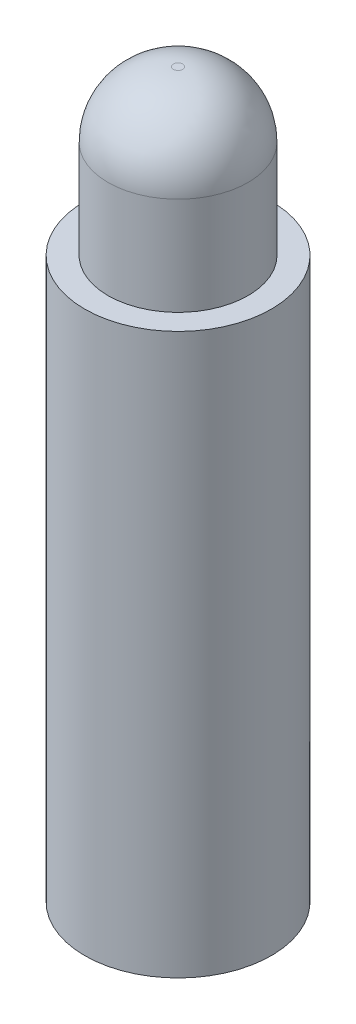
ISO-10303-21;
HEADER;
FILE_DESCRIPTION(('STEP AP214'),'2;1');
FILE_NAME('part.step','',(''),(''),'','','');
FILE_SCHEMA(('AUTOMOTIVE_DESIGN { 1 0 10303 214 1 1 1 1 }'));
ENDSEC;
DATA;
#1=APPLICATION_CONTEXT('core data for automotive mechanical design processes');
#2=APPLICATION_PROTOCOL_DEFINITION('international standard','automotive_design',2000,#1);
#3=PRODUCT_CONTEXT('',#1,'mechanical');
#4=PRODUCT('Part','Part','',(#3));
#5=PRODUCT_RELATED_PRODUCT_CATEGORY('part','',(#4));
#6=PRODUCT_DEFINITION_FORMATION('','',#4);
#7=PRODUCT_DEFINITION_CONTEXT('part definition',#1,'design');
#8=PRODUCT_DEFINITION('design','',#6,#7);
#9=PRODUCT_DEFINITION_SHAPE('','',#8);
#10=(LENGTH_UNIT() NAMED_UNIT(*) SI_UNIT(.MILLI.,.METRE.));
#11=(NAMED_UNIT(*) PLANE_ANGLE_UNIT() SI_UNIT($,.RADIAN.));
#12=(NAMED_UNIT(*) SI_UNIT($,.STERADIAN.) SOLID_ANGLE_UNIT());
#13=UNCERTAINTY_MEASURE_WITH_UNIT(LENGTH_MEASURE(1.E-05),#10,'distance_accuracy_value','');
#14=(GEOMETRIC_REPRESENTATION_CONTEXT(3) GLOBAL_UNCERTAINTY_ASSIGNED_CONTEXT((#13)) GLOBAL_UNIT_ASSIGNED_CONTEXT((#10,
#11,#12)) REPRESENTATION_CONTEXT('',''));
#15=CARTESIAN_POINT('',(0.,0.,0.));
#16=DIRECTION('',(0.,0.,1.));
#17=DIRECTION('',(1.,0.,0.));
#18=AXIS2_PLACEMENT_3D('',#15,#16,#17);
#19=CARTESIAN_POINT('',(0.,12.,0.));
#20=DIRECTION('',(0.,-1.,0.));
#21=DIRECTION('',(0.,0.,-1.));
#22=AXIS2_PLACEMENT_3D('',#19,#20,#21);
#23=CYLINDRICAL_SURFACE('',#22,2.);
#24=CARTESIAN_POINT('',(0.,12.,0.));
#25=DIRECTION('',(0.,1.,0.));
#26=DIRECTION('',(0.,0.,1.));
#27=AXIS2_PLACEMENT_3D('',#24,#25,#26);
#28=CIRCLE('',#27,2.);
#29=CARTESIAN_POINT('',(0.,12.,2.));
#30=VERTEX_POINT('',#29);
#31=EDGE_CURVE('E49',#30,#30,#28,.T.);
#32=ORIENTED_EDGE('',*,*,#31,.F.);
#33=EDGE_LOOP('',(#32));
#34=FACE_BOUND('',#33,.T.);
#35=CARTESIAN_POINT('',(0.,0.,0.));
#36=DIRECTION('',(0.,1.,0.));
#37=DIRECTION('',(0.,0.,1.));
#38=AXIS2_PLACEMENT_3D('',#35,#36,#37);
#39=CIRCLE('',#38,2.);
#40=CARTESIAN_POINT('',(0.,0.,2.));
#41=VERTEX_POINT('',#40);
#42=EDGE_CURVE('E52',#41,#41,#39,.T.);
#43=ORIENTED_EDGE('',*,*,#42,.T.);
#44=EDGE_LOOP('',(#43));
#45=FACE_BOUND('',#44,.T.);
#46=ADVANCED_FACE('F34',(#34,#45),#23,.T.);
#47=CARTESIAN_POINT('',(0.,12.,0.));
#48=DIRECTION('',(0.,1.,0.));
#49=DIRECTION('',(0.,0.,1.));
#50=AXIS2_PLACEMENT_3D('',#47,#48,#49);
#51=PLANE('',#50);
#52=CARTESIAN_POINT('',(0.,12.,0.));
#53=DIRECTION('',(0.,1.,0.));
#54=DIRECTION('',(0.,0.,1.));
#55=AXIS2_PLACEMENT_3D('',#52,#53,#54);
#56=CIRCLE('',#55,1.5);
#57=CARTESIAN_POINT('',(0.,12.,1.5));
#58=VERTEX_POINT('',#57);
#59=EDGE_CURVE('E45',#58,#58,#56,.T.);
#60=ORIENTED_EDGE('',*,*,#59,.F.);
#61=EDGE_LOOP('',(#60));
#62=FACE_BOUND('',#61,.T.);
#63=ORIENTED_EDGE('',*,*,#31,.T.);
#64=EDGE_LOOP('',(#63));
#65=FACE_BOUND('',#64,.T.);
#66=ADVANCED_FACE('F58',(#62,#65),#51,.T.);
#67=CARTESIAN_POINT('',(0.,0.,0.));
#68=DIRECTION('',(0.,1.,0.));
#69=DIRECTION('',(0.,0.,1.));
#70=AXIS2_PLACEMENT_3D('',#67,#68,#69);
#71=PLANE('',#70);
#72=ORIENTED_EDGE('',*,*,#42,.F.);
#73=EDGE_LOOP('',(#72));
#74=FACE_BOUND('',#73,.T.);
#75=ADVANCED_FACE('F64',(#74),#71,.F.);
#76=CARTESIAN_POINT('',(0.,15.5,0.));
#77=DIRECTION('',(0.,-1.,0.));
#78=DIRECTION('',(0.,0.,-1.));
#79=AXIS2_PLACEMENT_3D('',#76,#77,#78);
#80=CYLINDRICAL_SURFACE('',#79,1.5);
#81=CARTESIAN_POINT('',(0.,14.1,0.));
#82=DIRECTION('',(0.,1.,0.));
#83=DIRECTION('',(0.,0.,1.));
#84=AXIS2_PLACEMENT_3D('',#81,#82,#83);
#85=CIRCLE('',#84,1.5);
#86=CARTESIAN_POINT('',(0.,14.1,1.5));
#87=VERTEX_POINT('',#86);
#88=EDGE_CURVE('E10',#87,#87,#85,.F.);
#89=ORIENTED_EDGE('',*,*,#88,.T.);
#90=EDGE_LOOP('',(#89));
#91=FACE_BOUND('',#90,.T.);
#92=ORIENTED_EDGE('',*,*,#59,.T.);
#93=EDGE_LOOP('',(#92));
#94=FACE_BOUND('',#93,.T.);
#95=ADVANCED_FACE('F66',(#91,#94),#80,.T.);
#96=CARTESIAN_POINT('',(0.,15.5,0.));
#97=DIRECTION('',(0.,1.,0.));
#98=DIRECTION('',(0.,0.,1.));
#99=AXIS2_PLACEMENT_3D('',#96,#97,#98);
#100=PLANE('',#99);
#101=CARTESIAN_POINT('',(0.,15.5,0.));
#102=DIRECTION('',(0.,1.,0.));
#103=DIRECTION('',(0.,0.,1.));
#104=AXIS2_PLACEMENT_3D('',#101,#102,#103);
#105=CIRCLE('',#104,0.1);
#106=CARTESIAN_POINT('',(0.,15.5,0.1));
#107=VERTEX_POINT('',#106);
#108=EDGE_CURVE('E41',#107,#107,#105,.T.);
#109=ORIENTED_EDGE('',*,*,#108,.T.);
#110=EDGE_LOOP('',(#109));
#111=FACE_BOUND('',#110,.T.);
#112=ADVANCED_FACE('F72',(#111),#100,.T.);
#113=CARTESIAN_POINT('',(0.,14.1,0.));
#114=DIRECTION('',(0.,1.,0.));
#115=DIRECTION('',(0.,0.,1.));
#116=AXIS2_PLACEMENT_3D('',#113,#114,#115);
#117=DEGENERATE_TOROIDAL_SURFACE('',#116,0.1,1.4,.T.);
#118=ORIENTED_EDGE('',*,*,#88,.F.);
#119=EDGE_LOOP('',(#118));
#120=FACE_BOUND('',#119,.T.);
#121=ORIENTED_EDGE('',*,*,#108,.F.);
#122=EDGE_LOOP('',(#121));
#123=FACE_BOUND('',#122,.T.);
#124=ADVANCED_FACE('F36',(#120,#123),#117,.T.);
#125=CLOSED_SHELL('',(#46,#66,#75,#95,#112,#124));
#126=MANIFOLD_SOLID_BREP('B2',#125);
#127=ADVANCED_BREP_SHAPE_REPRESENTATION('',(#18,#126),#14);
#128=SHAPE_DEFINITION_REPRESENTATION(#9,#127);
ENDSEC;
END-ISO-10303-21;
